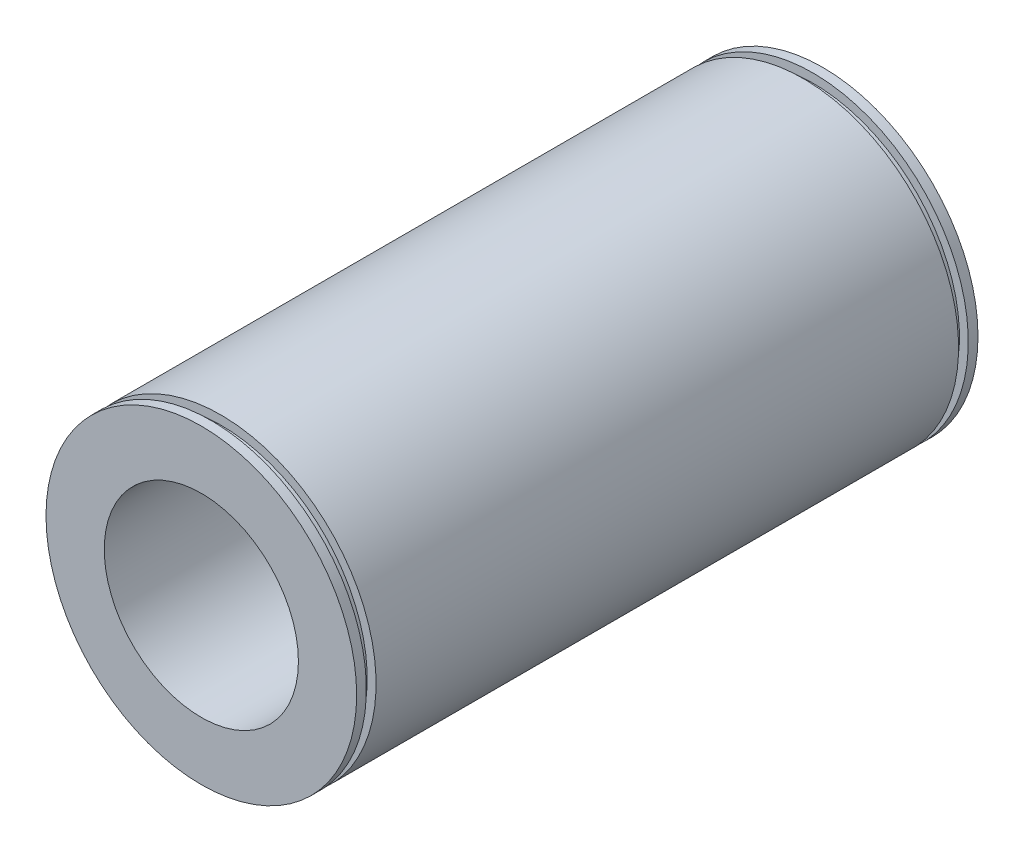
ISO-10303-21;
HEADER;
FILE_DESCRIPTION(('STEP AP214'),'2;1');
FILE_NAME('part.step','',(''),(''),'','','');
FILE_SCHEMA(('AUTOMOTIVE_DESIGN { 1 0 10303 214 1 1 1 1 }'));
ENDSEC;
DATA;
#1=APPLICATION_CONTEXT('core data for automotive mechanical design processes');
#2=APPLICATION_PROTOCOL_DEFINITION('international standard','automotive_design',2000,#1);
#3=PRODUCT_CONTEXT('',#1,'mechanical');
#4=PRODUCT('Part','Part','',(#3));
#5=PRODUCT_RELATED_PRODUCT_CATEGORY('part','',(#4));
#6=PRODUCT_DEFINITION_FORMATION('','',#4);
#7=PRODUCT_DEFINITION_CONTEXT('part definition',#1,'design');
#8=PRODUCT_DEFINITION('design','',#6,#7);
#9=PRODUCT_DEFINITION_SHAPE('','',#8);
#10=(LENGTH_UNIT() NAMED_UNIT(*) SI_UNIT(.MILLI.,.METRE.));
#11=(NAMED_UNIT(*) PLANE_ANGLE_UNIT() SI_UNIT($,.RADIAN.));
#12=(NAMED_UNIT(*) SI_UNIT($,.STERADIAN.) SOLID_ANGLE_UNIT());
#13=UNCERTAINTY_MEASURE_WITH_UNIT(LENGTH_MEASURE(1.E-05),#10,'distance_accuracy_value','');
#14=(GEOMETRIC_REPRESENTATION_CONTEXT(3) GLOBAL_UNCERTAINTY_ASSIGNED_CONTEXT((#13)) GLOBAL_UNIT_ASSIGNED_CONTEXT((#10,
#11,#12)) REPRESENTATION_CONTEXT('',''));
#15=CARTESIAN_POINT('',(0.,0.,0.));
#16=DIRECTION('',(0.,0.,1.));
#17=DIRECTION('',(1.,0.,0.));
#18=AXIS2_PLACEMENT_3D('',#15,#16,#17);
#19=CARTESIAN_POINT('',(0.,0.,50.8));
#20=DIRECTION('',(0.,0.,-1.));
#21=DIRECTION('',(-1.,0.,0.));
#22=AXIS2_PLACEMENT_3D('',#19,#20,#21);
#23=CYLINDRICAL_SURFACE('',#22,25.4);
#24=CARTESIAN_POINT('',(0.,0.,-49.2125));
#25=DIRECTION('',(0.,0.,-1.));
#26=DIRECTION('',(-1.,0.,0.));
#27=AXIS2_PLACEMENT_3D('',#24,#25,#26);
#28=CIRCLE('',#27,25.4);
#29=CARTESIAN_POINT('',(-25.4,0.,-49.2125));
#30=VERTEX_POINT('',#29);
#31=EDGE_CURVE('E91',#30,#30,#28,.T.);
#32=ORIENTED_EDGE('',*,*,#31,.T.);
#33=EDGE_LOOP('',(#32));
#34=FACE_BOUND('',#33,.T.);
#35=CARTESIAN_POINT('',(0.,0.,-50.8));
#36=DIRECTION('',(0.,0.,1.));
#37=DIRECTION('',(1.,0.,0.));
#38=AXIS2_PLACEMENT_3D('',#35,#36,#37);
#39=CIRCLE('',#38,25.4);
#40=CARTESIAN_POINT('',(25.4,0.,-50.8));
#41=VERTEX_POINT('',#40);
#42=EDGE_CURVE('E45',#41,#41,#39,.T.);
#43=ORIENTED_EDGE('',*,*,#42,.T.);
#44=EDGE_LOOP('',(#43));
#45=FACE_BOUND('',#44,.T.);
#46=ADVANCED_FACE('F41',(#34,#45),#23,.T.);
#47=CARTESIAN_POINT('',(0.,0.,49.2125));
#48=DIRECTION('',(0.,0.,-1.));
#49=DIRECTION('',(-1.,0.,0.));
#50=AXIS2_PLACEMENT_3D('',#47,#48,#49);
#51=CIRCLE('',#50,25.4);
#52=CARTESIAN_POINT('',(-25.4,0.,49.2125));
#53=VERTEX_POINT('',#52);
#54=EDGE_CURVE('E75',#53,#53,#51,.T.);
#55=ORIENTED_EDGE('',*,*,#54,.F.);
#56=EDGE_LOOP('',(#55));
#57=FACE_BOUND('',#56,.T.);
#58=CARTESIAN_POINT('',(0.,0.,50.8));
#59=DIRECTION('',(0.,0.,1.));
#60=DIRECTION('',(1.,0.,0.));
#61=AXIS2_PLACEMENT_3D('',#58,#59,#60);
#62=CIRCLE('',#61,25.4);
#63=CARTESIAN_POINT('',(25.4,0.,50.8));
#64=VERTEX_POINT('',#63);
#65=EDGE_CURVE('E10',#64,#64,#62,.T.);
#66=ORIENTED_EDGE('',*,*,#65,.F.);
#67=EDGE_LOOP('',(#66));
#68=FACE_BOUND('',#67,.T.);
#69=ADVANCED_FACE('F115',(#57,#68),#23,.T.);
#70=CARTESIAN_POINT('',(0.,0.,50.8));
#71=DIRECTION('',(0.,0.,1.));
#72=DIRECTION('',(1.,0.,0.));
#73=AXIS2_PLACEMENT_3D('',#70,#71,#72);
#74=PLANE('',#73);
#75=ORIENTED_EDGE('',*,*,#65,.T.);
#76=EDGE_LOOP('',(#75));
#77=FACE_BOUND('',#76,.T.);
#78=CARTESIAN_POINT('',(0.,0.,50.8));
#79=DIRECTION('',(0.,0.,1.));
#80=DIRECTION('',(1.,0.,0.));
#81=AXIS2_PLACEMENT_3D('',#78,#79,#80);
#82=CIRCLE('',#81,15.875);
#83=CARTESIAN_POINT('',(15.875,0.,50.8));
#84=VERTEX_POINT('',#83);
#85=EDGE_CURVE('E54',#84,#84,#82,.T.);
#86=ORIENTED_EDGE('',*,*,#85,.F.);
#87=EDGE_LOOP('',(#86));
#88=FACE_BOUND('',#87,.T.);
#89=ADVANCED_FACE('F119',(#77,#88),#74,.T.);
#90=CARTESIAN_POINT('',(0.,0.,-50.8));
#91=DIRECTION('',(0.,0.,1.));
#92=DIRECTION('',(1.,0.,0.));
#93=AXIS2_PLACEMENT_3D('',#90,#91,#92);
#94=PLANE('',#93);
#95=ORIENTED_EDGE('',*,*,#42,.F.);
#96=EDGE_LOOP('',(#95));
#97=FACE_BOUND('',#96,.T.);
#98=CARTESIAN_POINT('',(0.,0.,-50.8));
#99=DIRECTION('',(0.,0.,1.));
#100=DIRECTION('',(1.,0.,0.));
#101=AXIS2_PLACEMENT_3D('',#98,#99,#100);
#102=CIRCLE('',#101,15.875);
#103=CARTESIAN_POINT('',(15.875,0.,-50.8));
#104=VERTEX_POINT('',#103);
#105=EDGE_CURVE('E56',#104,#104,#102,.T.);
#106=ORIENTED_EDGE('',*,*,#105,.T.);
#107=EDGE_LOOP('',(#106));
#108=FACE_BOUND('',#107,.T.);
#109=ADVANCED_FACE('F123',(#97,#108),#94,.F.);
#110=CARTESIAN_POINT('',(0.,0.,-47.625));
#111=DIRECTION('',(0.,0.,-1.));
#112=DIRECTION('',(-1.,0.,0.));
#113=AXIS2_PLACEMENT_3D('',#110,#111,#112);
#114=CIRCLE('',#113,25.4);
#115=CARTESIAN_POINT('',(-25.4,0.,-47.625));
#116=VERTEX_POINT('',#115);
#117=EDGE_CURVE('E87',#116,#116,#114,.T.);
#118=ORIENTED_EDGE('',*,*,#117,.F.);
#119=EDGE_LOOP('',(#118));
#120=FACE_BOUND('',#119,.T.);
#121=CARTESIAN_POINT('',(0.,0.,47.625));
#122=DIRECTION('',(0.,0.,-1.));
#123=DIRECTION('',(-1.,0.,0.));
#124=AXIS2_PLACEMENT_3D('',#121,#122,#123);
#125=CIRCLE('',#124,25.4);
#126=CARTESIAN_POINT('',(-25.4,0.,47.625));
#127=VERTEX_POINT('',#126);
#128=EDGE_CURVE('E71',#127,#127,#125,.T.);
#129=ORIENTED_EDGE('',*,*,#128,.T.);
#130=EDGE_LOOP('',(#129));
#131=FACE_BOUND('',#130,.T.);
#132=ADVANCED_FACE('F43',(#120,#131),#23,.T.);
#133=CARTESIAN_POINT('',(0.,0.,50.8));
#134=DIRECTION('',(0.,0.,-1.));
#135=DIRECTION('',(-1.,0.,0.));
#136=AXIS2_PLACEMENT_3D('',#133,#134,#135);
#137=CYLINDRICAL_SURFACE('',#136,15.875);
#138=ORIENTED_EDGE('',*,*,#85,.T.);
#139=EDGE_LOOP('',(#138));
#140=FACE_BOUND('',#139,.T.);
#141=ORIENTED_EDGE('',*,*,#105,.F.);
#142=EDGE_LOOP('',(#141));
#143=FACE_BOUND('',#142,.T.);
#144=ADVANCED_FACE('F122',(#140,#143),#137,.F.);
#145=CARTESIAN_POINT('',(0.,25.4,49.2125));
#146=DIRECTION('',(0.,0.,1.));
#147=DIRECTION('',(1.,0.,0.));
#148=AXIS2_PLACEMENT_3D('',#145,#146,#147);
#149=PLANE('',#148);
#150=CARTESIAN_POINT('',(0.,0.,49.2125));
#151=DIRECTION('',(0.,0.,-1.));
#152=DIRECTION('',(-1.,0.,0.));
#153=AXIS2_PLACEMENT_3D('',#150,#151,#152);
#154=CIRCLE('',#153,23.9522);
#155=CARTESIAN_POINT('',(-23.9522,0.,49.2125));
#156=VERTEX_POINT('',#155);
#157=EDGE_CURVE('E60',#156,#156,#154,.T.);
#158=ORIENTED_EDGE('',*,*,#157,.F.);
#159=EDGE_LOOP('',(#158));
#160=FACE_BOUND('',#159,.T.);
#161=ORIENTED_EDGE('',*,*,#54,.T.);
#162=EDGE_LOOP('',(#161));
#163=FACE_BOUND('',#162,.T.);
#164=ADVANCED_FACE('F129',(#160,#163),#149,.F.);
#165=CARTESIAN_POINT('',(0.,0.,0.));
#166=DIRECTION('',(0.,0.,-1.));
#167=DIRECTION('',(-1.,0.,0.));
#168=AXIS2_PLACEMENT_3D('',#165,#166,#167);
#169=CYLINDRICAL_SURFACE('',#168,23.9522);
#170=CARTESIAN_POINT('',(0.,0.,47.625));
#171=DIRECTION('',(0.,0.,-1.));
#172=DIRECTION('',(-1.,0.,0.));
#173=AXIS2_PLACEMENT_3D('',#170,#171,#172);
#174=CIRCLE('',#173,23.9522);
#175=CARTESIAN_POINT('',(-23.9522,0.,47.625));
#176=VERTEX_POINT('',#175);
#177=EDGE_CURVE('E67',#176,#176,#174,.T.);
#178=ORIENTED_EDGE('',*,*,#177,.F.);
#179=EDGE_LOOP('',(#178));
#180=FACE_BOUND('',#179,.T.);
#181=ORIENTED_EDGE('',*,*,#157,.T.);
#182=EDGE_LOOP('',(#181));
#183=FACE_BOUND('',#182,.T.);
#184=ADVANCED_FACE('F111',(#180,#183),#169,.T.);
#185=CARTESIAN_POINT('',(0.,25.4,47.625));
#186=DIRECTION('',(0.,0.,-1.));
#187=DIRECTION('',(-1.,0.,0.));
#188=AXIS2_PLACEMENT_3D('',#185,#186,#187);
#189=PLANE('',#188);
#190=ORIENTED_EDGE('',*,*,#128,.F.);
#191=EDGE_LOOP('',(#190));
#192=FACE_BOUND('',#191,.T.);
#193=ORIENTED_EDGE('',*,*,#177,.T.);
#194=EDGE_LOOP('',(#193));
#195=FACE_BOUND('',#194,.T.);
#196=ADVANCED_FACE('F101',(#192,#195),#189,.F.);
#197=CARTESIAN_POINT('',(0.,25.4,-49.2125));
#198=DIRECTION('',(0.,0.,-1.));
#199=DIRECTION('',(1.,0.,0.));
#200=AXIS2_PLACEMENT_3D('',#197,#198,#199);
#201=PLANE('',#200);
#202=CARTESIAN_POINT('',(0.,0.,-49.2125));
#203=DIRECTION('',(0.,0.,-1.));
#204=DIRECTION('',(-1.,0.,0.));
#205=AXIS2_PLACEMENT_3D('',#202,#203,#204);
#206=CIRCLE('',#205,23.9522);
#207=CARTESIAN_POINT('',(-23.9522,0.,-49.2125));
#208=VERTEX_POINT('',#207);
#209=EDGE_CURVE('E79',#208,#208,#206,.T.);
#210=ORIENTED_EDGE('',*,*,#209,.T.);
#211=EDGE_LOOP('',(#210));
#212=FACE_BOUND('',#211,.T.);
#213=ORIENTED_EDGE('',*,*,#31,.F.);
#214=EDGE_LOOP('',(#213));
#215=FACE_BOUND('',#214,.T.);
#216=ADVANCED_FACE('F98',(#212,#215),#201,.F.);
#217=CARTESIAN_POINT('',(0.,0.,0.));
#218=DIRECTION('',(0.,0.,1.));
#219=DIRECTION('',(-1.,0.,0.));
#220=AXIS2_PLACEMENT_3D('',#217,#218,#219);
#221=CYLINDRICAL_SURFACE('',#220,23.9522);
#222=CARTESIAN_POINT('',(0.,0.,-47.625));
#223=DIRECTION('',(0.,0.,-1.));
#224=DIRECTION('',(-1.,0.,0.));
#225=AXIS2_PLACEMENT_3D('',#222,#223,#224);
#226=CIRCLE('',#225,23.9522);
#227=CARTESIAN_POINT('',(-23.9522,0.,-47.625));
#228=VERTEX_POINT('',#227);
#229=EDGE_CURVE('E83',#228,#228,#226,.T.);
#230=ORIENTED_EDGE('',*,*,#229,.T.);
#231=EDGE_LOOP('',(#230));
#232=FACE_BOUND('',#231,.T.);
#233=ORIENTED_EDGE('',*,*,#209,.F.);
#234=EDGE_LOOP('',(#233));
#235=FACE_BOUND('',#234,.T.);
#236=ADVANCED_FACE('F100',(#232,#235),#221,.T.);
#237=CARTESIAN_POINT('',(0.,25.4,-47.625));
#238=DIRECTION('',(0.,0.,1.));
#239=DIRECTION('',(-1.,0.,0.));
#240=AXIS2_PLACEMENT_3D('',#237,#238,#239);
#241=PLANE('',#240);
#242=ORIENTED_EDGE('',*,*,#117,.T.);
#243=EDGE_LOOP('',(#242));
#244=FACE_BOUND('',#243,.T.);
#245=ORIENTED_EDGE('',*,*,#229,.F.);
#246=EDGE_LOOP('',(#245));
#247=FACE_BOUND('',#246,.T.);
#248=ADVANCED_FACE('F108',(#244,#247),#241,.F.);
#249=CLOSED_SHELL('',(#46,#69,#89,#109,#132,#144,#164,#184,#196,#216,#236,#248));
#250=MANIFOLD_SOLID_BREP('B2',#249);
#251=ADVANCED_BREP_SHAPE_REPRESENTATION('',(#18,#250),#14);
#252=SHAPE_DEFINITION_REPRESENTATION(#9,#251);
ENDSEC;
END-ISO-10303-21;
